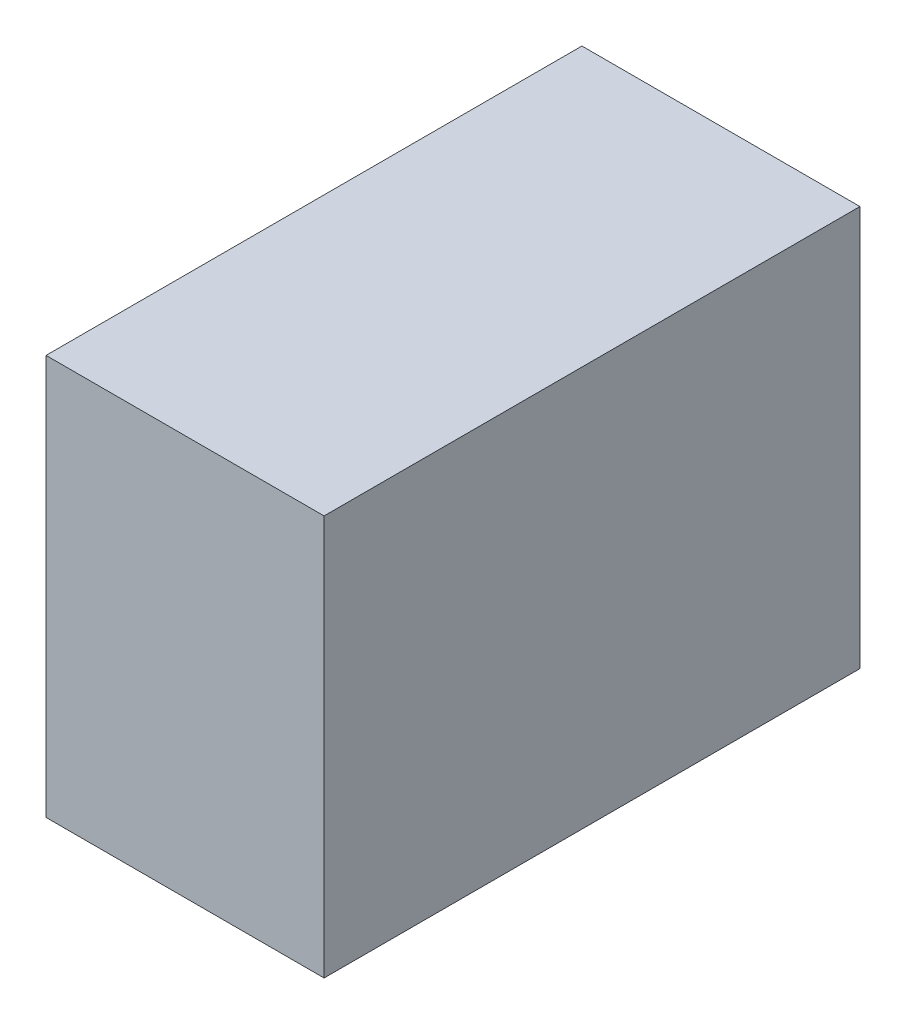
ISO-10303-21;
HEADER;
FILE_DESCRIPTION(('STEP AP214'),'2;1');
FILE_NAME('part.step','',(''),(''),'','','');
FILE_SCHEMA(('AUTOMOTIVE_DESIGN { 1 0 10303 214 1 1 1 1 }'));
ENDSEC;
DATA;
#1=APPLICATION_CONTEXT('core data for automotive mechanical design processes');
#2=APPLICATION_PROTOCOL_DEFINITION('international standard','automotive_design',2000,#1);
#3=PRODUCT_CONTEXT('',#1,'mechanical');
#4=PRODUCT('Part','Part','',(#3));
#5=PRODUCT_RELATED_PRODUCT_CATEGORY('part','',(#4));
#6=PRODUCT_DEFINITION_FORMATION('','',#4);
#7=PRODUCT_DEFINITION_CONTEXT('part definition',#1,'design');
#8=PRODUCT_DEFINITION('design','',#6,#7);
#9=PRODUCT_DEFINITION_SHAPE('','',#8);
#10=(LENGTH_UNIT() NAMED_UNIT(*) SI_UNIT(.MILLI.,.METRE.));
#11=(NAMED_UNIT(*) PLANE_ANGLE_UNIT() SI_UNIT($,.RADIAN.));
#12=(NAMED_UNIT(*) SI_UNIT($,.STERADIAN.) SOLID_ANGLE_UNIT());
#13=UNCERTAINTY_MEASURE_WITH_UNIT(LENGTH_MEASURE(1.E-05),#10,'distance_accuracy_value','');
#14=(GEOMETRIC_REPRESENTATION_CONTEXT(3) GLOBAL_UNCERTAINTY_ASSIGNED_CONTEXT((#13)) GLOBAL_UNIT_ASSIGNED_CONTEXT((#10,
#11,#12)) REPRESENTATION_CONTEXT('',''));
#15=CARTESIAN_POINT('',(0.,0.,0.));
#16=DIRECTION('',(0.,0.,1.));
#17=DIRECTION('',(1.,0.,0.));
#18=AXIS2_PLACEMENT_3D('',#15,#16,#17);
#19=CARTESIAN_POINT('',(-50.8,0.,0.));
#20=DIRECTION('',(0.,0.,1.));
#21=DIRECTION('',(1.,0.,0.));
#22=AXIS2_PLACEMENT_3D('',#19,#20,#21);
#23=PLANE('',#22);
#24=DIRECTION('',(0.,-1.,0.));
#25=VECTOR('',#24,1.);
#26=CARTESIAN_POINT('',(0.,0.,0.));
#27=LINE('',#26,#25);
#28=CARTESIAN_POINT('',(0.,73.1150195885394,0.));
#29=VERTEX_POINT('',#28);
#30=CARTESIAN_POINT('',(0.,0.,0.));
#31=VERTEX_POINT('',#30);
#32=EDGE_CURVE('E95',#29,#31,#27,.T.);
#33=ORIENTED_EDGE('',*,*,#32,.F.);
#34=DIRECTION('',(1.,0.,0.));
#35=VECTOR('',#34,1.);
#36=CARTESIAN_POINT('',(-50.8,73.1150195885394,0.));
#37=LINE('',#36,#35);
#38=CARTESIAN_POINT('',(-50.8,73.1150195885394,0.));
#39=VERTEX_POINT('',#38);
#40=EDGE_CURVE('E11',#39,#29,#37,.T.);
#41=ORIENTED_EDGE('',*,*,#40,.F.);
#42=DIRECTION('',(0.,-1.,0.));
#43=VECTOR('',#42,1.);
#44=CARTESIAN_POINT('',(-50.8,0.,0.));
#45=LINE('',#44,#43);
#46=CARTESIAN_POINT('',(-50.8,0.,0.));
#47=VERTEX_POINT('',#46);
#48=EDGE_CURVE('E89',#39,#47,#45,.T.);
#49=ORIENTED_EDGE('',*,*,#48,.T.);
#50=DIRECTION('',(1.,0.,0.));
#51=VECTOR('',#50,1.);
#52=CARTESIAN_POINT('',(-50.8,0.,0.));
#53=LINE('',#52,#51);
#54=EDGE_CURVE('E34',#47,#31,#53,.T.);
#55=ORIENTED_EDGE('',*,*,#54,.T.);
#56=EDGE_LOOP('',(#33,#41,#49,#55));
#57=FACE_BOUND('',#56,.T.);
#58=ADVANCED_FACE('F31',(#57),#23,.T.);
#59=CARTESIAN_POINT('',(-50.8,73.1150195885394,0.));
#60=DIRECTION('',(0.,1.,0.));
#61=DIRECTION('',(0.,0.,1.));
#62=AXIS2_PLACEMENT_3D('',#59,#60,#61);
#63=PLANE('',#62);
#64=DIRECTION('',(0.,0.,1.));
#65=VECTOR('',#64,1.);
#66=CARTESIAN_POINT('',(0.,73.1150195885394,0.));
#67=LINE('',#66,#65);
#68=CARTESIAN_POINT('',(0.,73.1150195885394,-97.9052284389028));
#69=VERTEX_POINT('',#68);
#70=EDGE_CURVE('E91',#69,#29,#67,.T.);
#71=ORIENTED_EDGE('',*,*,#70,.F.);
#72=DIRECTION('',(1.,0.,0.));
#73=VECTOR('',#72,1.);
#74=CARTESIAN_POINT('',(-50.8,73.1150195885394,-97.9052284389028));
#75=LINE('',#74,#73);
#76=CARTESIAN_POINT('',(-50.8,73.1150195885394,-97.9052284389028));
#77=VERTEX_POINT('',#76);
#78=EDGE_CURVE('E40',#77,#69,#75,.T.);
#79=ORIENTED_EDGE('',*,*,#78,.F.);
#80=DIRECTION('',(0.,0.,1.));
#81=VECTOR('',#80,1.);
#82=CARTESIAN_POINT('',(-50.8,73.1150195885394,0.));
#83=LINE('',#82,#81);
#84=EDGE_CURVE('E86',#77,#39,#83,.T.);
#85=ORIENTED_EDGE('',*,*,#84,.T.);
#86=ORIENTED_EDGE('',*,*,#40,.T.);
#87=EDGE_LOOP('',(#71,#79,#85,#86));
#88=FACE_BOUND('',#87,.T.);
#89=ADVANCED_FACE('F105',(#88),#63,.T.);
#90=CARTESIAN_POINT('',(-50.8,0.,-97.9052284389028));
#91=DIRECTION('',(0.,0.,-1.));
#92=DIRECTION('',(-1.,0.,0.));
#93=AXIS2_PLACEMENT_3D('',#90,#91,#92);
#94=PLANE('',#93);
#95=DIRECTION('',(0.,1.,0.));
#96=VECTOR('',#95,1.);
#97=CARTESIAN_POINT('',(0.,0.,-97.9052284389028));
#98=LINE('',#97,#96);
#99=CARTESIAN_POINT('',(0.,0.,-97.9052284389028));
#100=VERTEX_POINT('',#99);
#101=EDGE_CURVE('E81',#100,#69,#98,.T.);
#102=ORIENTED_EDGE('',*,*,#101,.F.);
#103=DIRECTION('',(1.,0.,0.));
#104=VECTOR('',#103,1.);
#105=CARTESIAN_POINT('',(-50.8,0.,-97.9052284389028));
#106=LINE('',#105,#104);
#107=CARTESIAN_POINT('',(-50.8,0.,-97.9052284389028));
#108=VERTEX_POINT('',#107);
#109=EDGE_CURVE('E76',#108,#100,#106,.T.);
#110=ORIENTED_EDGE('',*,*,#109,.F.);
#111=DIRECTION('',(0.,1.,0.));
#112=VECTOR('',#111,1.);
#113=CARTESIAN_POINT('',(-50.8,0.,-97.9052284389028));
#114=LINE('',#113,#112);
#115=EDGE_CURVE('E79',#108,#77,#114,.T.);
#116=ORIENTED_EDGE('',*,*,#115,.T.);
#117=ORIENTED_EDGE('',*,*,#78,.T.);
#118=EDGE_LOOP('',(#102,#110,#116,#117));
#119=FACE_BOUND('',#118,.T.);
#120=ADVANCED_FACE('F78',(#119),#94,.T.);
#121=CARTESIAN_POINT('',(-50.8,0.,0.));
#122=DIRECTION('',(0.,-1.,0.));
#123=DIRECTION('',(0.,0.,-1.));
#124=AXIS2_PLACEMENT_3D('',#121,#122,#123);
#125=PLANE('',#124);
#126=DIRECTION('',(0.,0.,-1.));
#127=VECTOR('',#126,1.);
#128=CARTESIAN_POINT('',(0.,0.,0.));
#129=LINE('',#128,#127);
#130=EDGE_CURVE('E98',#31,#100,#129,.T.);
#131=ORIENTED_EDGE('',*,*,#130,.F.);
#132=ORIENTED_EDGE('',*,*,#54,.F.);
#133=DIRECTION('',(0.,0.,-1.));
#134=VECTOR('',#133,1.);
#135=CARTESIAN_POINT('',(-50.8,0.,0.));
#136=LINE('',#135,#134);
#137=EDGE_CURVE('E85',#47,#108,#136,.T.);
#138=ORIENTED_EDGE('',*,*,#137,.T.);
#139=ORIENTED_EDGE('',*,*,#109,.T.);
#140=EDGE_LOOP('',(#131,#132,#138,#139));
#141=FACE_BOUND('',#140,.T.);
#142=ADVANCED_FACE('F88',(#141),#125,.T.);
#143=CARTESIAN_POINT('',(-50.8,73.1150195885394,0.));
#144=DIRECTION('',(-1.,0.,0.));
#145=DIRECTION('',(0.,0.,1.));
#146=AXIS2_PLACEMENT_3D('',#143,#144,#145);
#147=PLANE('',#146);
#148=ORIENTED_EDGE('',*,*,#48,.F.);
#149=ORIENTED_EDGE('',*,*,#84,.F.);
#150=ORIENTED_EDGE('',*,*,#115,.F.);
#151=ORIENTED_EDGE('',*,*,#137,.F.);
#152=EDGE_LOOP('',(#148,#149,#150,#151));
#153=FACE_BOUND('',#152,.T.);
#154=ADVANCED_FACE('F84',(#153),#147,.T.);
#155=CARTESIAN_POINT('',(0.,73.1150195885394,0.));
#156=DIRECTION('',(-1.,0.,0.));
#157=DIRECTION('',(0.,0.,1.));
#158=AXIS2_PLACEMENT_3D('',#155,#156,#157);
#159=PLANE('',#158);
#160=ORIENTED_EDGE('',*,*,#32,.T.);
#161=ORIENTED_EDGE('',*,*,#130,.T.);
#162=ORIENTED_EDGE('',*,*,#101,.T.);
#163=ORIENTED_EDGE('',*,*,#70,.T.);
#164=EDGE_LOOP('',(#160,#161,#162,#163));
#165=FACE_BOUND('',#164,.T.);
#166=ADVANCED_FACE('F104',(#165),#159,.F.);
#167=CLOSED_SHELL('',(#58,#89,#120,#142,#154,#166));
#168=MANIFOLD_SOLID_BREP('B2',#167);
#169=ADVANCED_BREP_SHAPE_REPRESENTATION('',(#18,#168),#14);
#170=SHAPE_DEFINITION_REPRESENTATION(#9,#169);
ENDSEC;
END-ISO-10303-21;
